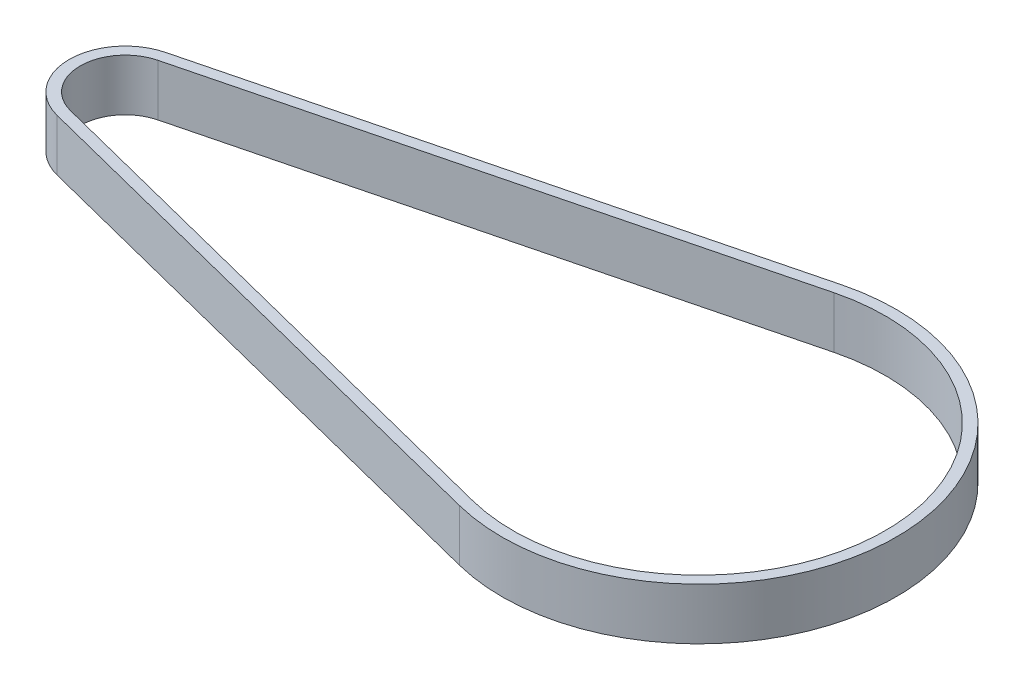
ISO-10303-21;
HEADER;
FILE_DESCRIPTION(('STEP AP214'),'2;1');
FILE_NAME('part.step','',(''),(''),'','','');
FILE_SCHEMA(('AUTOMOTIVE_DESIGN { 1 0 10303 214 1 1 1 1 }'));
ENDSEC;
DATA;
#1=APPLICATION_CONTEXT('core data for automotive mechanical design processes');
#2=APPLICATION_PROTOCOL_DEFINITION('international standard','automotive_design',2000,#1);
#3=PRODUCT_CONTEXT('',#1,'mechanical');
#4=PRODUCT('Part','Part','',(#3));
#5=PRODUCT_RELATED_PRODUCT_CATEGORY('part','',(#4));
#6=PRODUCT_DEFINITION_FORMATION('','',#4);
#7=PRODUCT_DEFINITION_CONTEXT('part definition',#1,'design');
#8=PRODUCT_DEFINITION('design','',#6,#7);
#9=PRODUCT_DEFINITION_SHAPE('','',#8);
#10=(LENGTH_UNIT() NAMED_UNIT(*) SI_UNIT(.MILLI.,.METRE.));
#11=(NAMED_UNIT(*) PLANE_ANGLE_UNIT() SI_UNIT($,.RADIAN.));
#12=(NAMED_UNIT(*) SI_UNIT($,.STERADIAN.) SOLID_ANGLE_UNIT());
#13=UNCERTAINTY_MEASURE_WITH_UNIT(LENGTH_MEASURE(1.E-05),#10,'distance_accuracy_value','');
#14=(GEOMETRIC_REPRESENTATION_CONTEXT(3) GLOBAL_UNCERTAINTY_ASSIGNED_CONTEXT((#13)) GLOBAL_UNIT_ASSIGNED_CONTEXT((#10,
#11,#12)) REPRESENTATION_CONTEXT('',''));
#15=CARTESIAN_POINT('',(0.,0.,0.));
#16=DIRECTION('',(0.,0.,1.));
#17=DIRECTION('',(1.,0.,0.));
#18=AXIS2_PLACEMENT_3D('',#15,#16,#17);
#19=CARTESIAN_POINT('',(0.,7.,0.));
#20=DIRECTION('',(0.,1.,0.));
#21=DIRECTION('',(0.,0.,1.));
#22=AXIS2_PLACEMENT_3D('',#19,#20,#21);
#23=PLANE('',#22);
#24=CARTESIAN_POINT('',(0.,7.,0.));
#25=DIRECTION('',(0.,1.,0.));
#26=DIRECTION('',(0.,0.,1.));
#27=AXIS2_PLACEMENT_3D('',#24,#25,#26);
#28=CIRCLE('',#27,7.6);
#29=CARTESIAN_POINT('',(-1.86821106821106,7.,-7.36680306541539));
#30=VERTEX_POINT('',#29);
#31=CARTESIAN_POINT('',(-1.86821106821107,7.,7.36680306541539));
#32=VERTEX_POINT('',#31);
#33=EDGE_CURVE('E134',#30,#32,#28,.T.);
#34=ORIENTED_EDGE('',*,*,#33,.T.);
#35=DIRECTION('',(0.969316192817815,0.,0.245817245817246));
#36=VECTOR('',#35,1.);
#37=CARTESIAN_POINT('',(-1.86821106821107,7.,7.36680306541539));
#38=LINE('',#37,#36);
#39=CARTESIAN_POINT('',(71.1366795366795,7.,25.8807423482356));
#40=VERTEX_POINT('',#39);
#41=EDGE_CURVE('E137',#32,#40,#38,.T.);
#42=ORIENTED_EDGE('',*,*,#41,.T.);
#43=CARTESIAN_POINT('',(77.7,7.,0.));
#44=DIRECTION('',(0.,1.,0.));
#45=DIRECTION('',(0.,0.,1.));
#46=AXIS2_PLACEMENT_3D('',#43,#44,#45);
#47=CIRCLE('',#46,26.7);
#48=CARTESIAN_POINT('',(71.1366795366796,7.,-25.8807423482356));
#49=VERTEX_POINT('',#48);
#50=EDGE_CURVE('E140',#40,#49,#47,.T.);
#51=ORIENTED_EDGE('',*,*,#50,.T.);
#52=DIRECTION('',(-0.969316192817815,0.,0.245817245817245));
#53=VECTOR('',#52,1.);
#54=CARTESIAN_POINT('',(-1.86821106821106,7.,-7.36680306541539));
#55=LINE('',#54,#53);
#56=EDGE_CURVE('E142',#49,#30,#55,.T.);
#57=ORIENTED_EDGE('',*,*,#56,.T.);
#58=EDGE_LOOP('',(#34,#42,#51,#57));
#59=FACE_BOUND('',#58,.T.);
#60=DIRECTION('',(0.969316192817815,0.,0.245817245817245));
#61=VECTOR('',#60,1.);
#62=CARTESIAN_POINT('',(-1.4994851994852,7.,5.91282877618867));
#63=LINE('',#62,#61);
#64=CARTESIAN_POINT('',(-1.4994851994852,7.,5.91282877618867));
#65=VERTEX_POINT('',#64);
#66=CARTESIAN_POINT('',(71.5054054054054,7.,24.4267680590089));
#67=VERTEX_POINT('',#66);
#68=EDGE_CURVE('E106',#65,#67,#63,.T.);
#69=ORIENTED_EDGE('',*,*,#68,.F.);
#70=CARTESIAN_POINT('',(0.,7.,0.));
#71=DIRECTION('',(0.,1.,0.));
#72=DIRECTION('',(0.,0.,1.));
#73=AXIS2_PLACEMENT_3D('',#70,#71,#72);
#74=CIRCLE('',#73,6.09999999999999);
#75=CARTESIAN_POINT('',(-1.4994851994852,7.,-5.91282877618867));
#76=VERTEX_POINT('',#75);
#77=EDGE_CURVE('E98',#76,#65,#74,.T.);
#78=ORIENTED_EDGE('',*,*,#77,.F.);
#79=DIRECTION('',(-0.969316192817815,0.,0.245817245817245));
#80=VECTOR('',#79,1.);
#81=CARTESIAN_POINT('',(-1.4994851994852,7.,-5.91282877618867));
#82=LINE('',#81,#80);
#83=CARTESIAN_POINT('',(71.5054054054054,7.,-24.4267680590089));
#84=VERTEX_POINT('',#83);
#85=EDGE_CURVE('E120',#84,#76,#82,.T.);
#86=ORIENTED_EDGE('',*,*,#85,.F.);
#87=CARTESIAN_POINT('',(77.7,7.,0.));
#88=DIRECTION('',(0.,1.,0.));
#89=DIRECTION('',(0.,0.,1.));
#90=AXIS2_PLACEMENT_3D('',#87,#88,#89);
#91=CIRCLE('',#90,25.2);
#92=EDGE_CURVE('E118',#67,#84,#91,.T.);
#93=ORIENTED_EDGE('',*,*,#92,.F.);
#94=EDGE_LOOP('',(#69,#78,#86,#93));
#95=FACE_BOUND('',#94,.T.);
#96=ADVANCED_FACE('F33',(#59,#95),#23,.T.);
#97=CARTESIAN_POINT('',(0.,0.,0.));
#98=DIRECTION('',(0.,1.,0.));
#99=DIRECTION('',(0.,0.,1.));
#100=AXIS2_PLACEMENT_3D('',#97,#98,#99);
#101=PLANE('',#100);
#102=CARTESIAN_POINT('',(0.,0.,0.));
#103=DIRECTION('',(0.,1.,0.));
#104=DIRECTION('',(0.,0.,1.));
#105=AXIS2_PLACEMENT_3D('',#102,#103,#104);
#106=CIRCLE('',#105,7.6);
#107=CARTESIAN_POINT('',(-1.86821106821106,0.,-7.36680306541539));
#108=VERTEX_POINT('',#107);
#109=CARTESIAN_POINT('',(-1.86821106821107,0.,7.36680306541539));
#110=VERTEX_POINT('',#109);
#111=EDGE_CURVE('E114',#108,#110,#106,.T.);
#112=ORIENTED_EDGE('',*,*,#111,.F.);
#113=DIRECTION('',(-0.969316192817815,0.,0.245817245817245));
#114=VECTOR('',#113,1.);
#115=CARTESIAN_POINT('',(-1.86821106821106,0.,-7.36680306541539));
#116=LINE('',#115,#114);
#117=CARTESIAN_POINT('',(71.1366795366796,0.,-25.8807423482356));
#118=VERTEX_POINT('',#117);
#119=EDGE_CURVE('E138',#118,#108,#116,.T.);
#120=ORIENTED_EDGE('',*,*,#119,.F.);
#121=CARTESIAN_POINT('',(77.7,0.,0.));
#122=DIRECTION('',(0.,1.,0.));
#123=DIRECTION('',(0.,0.,1.));
#124=AXIS2_PLACEMENT_3D('',#121,#122,#123);
#125=CIRCLE('',#124,26.7);
#126=CARTESIAN_POINT('',(71.1366795366795,0.,25.8807423482356));
#127=VERTEX_POINT('',#126);
#128=EDGE_CURVE('E149',#127,#118,#125,.T.);
#129=ORIENTED_EDGE('',*,*,#128,.F.);
#130=DIRECTION('',(0.969316192817815,0.,0.245817245817246));
#131=VECTOR('',#130,1.);
#132=CARTESIAN_POINT('',(-1.86821106821107,0.,7.36680306541539));
#133=LINE('',#132,#131);
#134=EDGE_CURVE('E147',#110,#127,#133,.T.);
#135=ORIENTED_EDGE('',*,*,#134,.F.);
#136=EDGE_LOOP('',(#112,#120,#129,#135));
#137=FACE_BOUND('',#136,.T.);
#138=CARTESIAN_POINT('',(0.,0.,0.));
#139=DIRECTION('',(0.,1.,0.));
#140=DIRECTION('',(0.,0.,1.));
#141=AXIS2_PLACEMENT_3D('',#138,#139,#140);
#142=CIRCLE('',#141,6.09999999999999);
#143=CARTESIAN_POINT('',(-1.4994851994852,0.,-5.91282877618867));
#144=VERTEX_POINT('',#143);
#145=CARTESIAN_POINT('',(-1.4994851994852,0.,5.91282877618867));
#146=VERTEX_POINT('',#145);
#147=EDGE_CURVE('E56',#144,#146,#142,.T.);
#148=ORIENTED_EDGE('',*,*,#147,.T.);
#149=DIRECTION('',(0.969316192817815,0.,0.245817245817245));
#150=VECTOR('',#149,1.);
#151=CARTESIAN_POINT('',(-1.4994851994852,0.,5.91282877618867));
#152=LINE('',#151,#150);
#153=CARTESIAN_POINT('',(71.5054054054054,0.,24.4267680590089));
#154=VERTEX_POINT('',#153);
#155=EDGE_CURVE('E113',#146,#154,#152,.T.);
#156=ORIENTED_EDGE('',*,*,#155,.T.);
#157=CARTESIAN_POINT('',(77.7,0.,0.));
#158=DIRECTION('',(0.,1.,0.));
#159=DIRECTION('',(0.,0.,1.));
#160=AXIS2_PLACEMENT_3D('',#157,#158,#159);
#161=CIRCLE('',#160,25.2);
#162=CARTESIAN_POINT('',(71.5054054054054,0.,-24.4267680590089));
#163=VERTEX_POINT('',#162);
#164=EDGE_CURVE('E126',#154,#163,#161,.T.);
#165=ORIENTED_EDGE('',*,*,#164,.T.);
#166=DIRECTION('',(-0.969316192817815,0.,0.245817245817245));
#167=VECTOR('',#166,1.);
#168=CARTESIAN_POINT('',(-1.4994851994852,0.,-5.91282877618867));
#169=LINE('',#168,#167);
#170=EDGE_CURVE('E107',#163,#144,#169,.T.);
#171=ORIENTED_EDGE('',*,*,#170,.T.);
#172=EDGE_LOOP('',(#148,#156,#165,#171));
#173=FACE_BOUND('',#172,.T.);
#174=ADVANCED_FACE('F167',(#137,#173),#101,.F.);
#175=CARTESIAN_POINT('',(0.,7.,0.));
#176=DIRECTION('',(0.,-1.,0.));
#177=DIRECTION('',(0.,0.,-1.));
#178=AXIS2_PLACEMENT_3D('',#175,#176,#177);
#179=CYLINDRICAL_SURFACE('',#178,7.6);
#180=ORIENTED_EDGE('',*,*,#111,.T.);
#181=DIRECTION('',(0.,-1.,0.));
#182=VECTOR('',#181,1.);
#183=CARTESIAN_POINT('',(-1.86821106821107,7.,7.36680306541539));
#184=LINE('',#183,#182);
#185=EDGE_CURVE('E11',#32,#110,#184,.T.);
#186=ORIENTED_EDGE('',*,*,#185,.F.);
#187=ORIENTED_EDGE('',*,*,#33,.F.);
#188=DIRECTION('',(0.,-1.,0.));
#189=VECTOR('',#188,1.);
#190=CARTESIAN_POINT('',(-1.86821106821106,7.,-7.36680306541539));
#191=LINE('',#190,#189);
#192=EDGE_CURVE('E144',#30,#108,#191,.T.);
#193=ORIENTED_EDGE('',*,*,#192,.T.);
#194=EDGE_LOOP('',(#180,#186,#187,#193));
#195=FACE_BOUND('',#194,.T.);
#196=ADVANCED_FACE('F35',(#195),#179,.T.);
#197=CARTESIAN_POINT('',(-1.86821106821107,7.,7.36680306541539));
#198=DIRECTION('',(0.245817245817246,0.,-0.969316192817815));
#199=DIRECTION('',(-0.969316192817815,0.,-0.245817245817246));
#200=AXIS2_PLACEMENT_3D('',#197,#198,#199);
#201=PLANE('',#200);
#202=ORIENTED_EDGE('',*,*,#134,.T.);
#203=DIRECTION('',(0.,-1.,0.));
#204=VECTOR('',#203,1.);
#205=CARTESIAN_POINT('',(71.1366795366795,7.,25.8807423482356));
#206=LINE('',#205,#204);
#207=EDGE_CURVE('E41',#40,#127,#206,.T.);
#208=ORIENTED_EDGE('',*,*,#207,.F.);
#209=ORIENTED_EDGE('',*,*,#41,.F.);
#210=ORIENTED_EDGE('',*,*,#185,.T.);
#211=EDGE_LOOP('',(#202,#208,#209,#210));
#212=FACE_BOUND('',#211,.T.);
#213=ADVANCED_FACE('F177',(#212),#201,.F.);
#214=CARTESIAN_POINT('',(77.7,7.,0.));
#215=DIRECTION('',(0.,-1.,0.));
#216=DIRECTION('',(0.,0.,-1.));
#217=AXIS2_PLACEMENT_3D('',#214,#215,#216);
#218=CYLINDRICAL_SURFACE('',#217,26.7);
#219=ORIENTED_EDGE('',*,*,#128,.T.);
#220=DIRECTION('',(0.,-1.,0.));
#221=VECTOR('',#220,1.);
#222=CARTESIAN_POINT('',(71.1366795366796,7.,-25.8807423482356));
#223=LINE('',#222,#221);
#224=EDGE_CURVE('E154',#49,#118,#223,.T.);
#225=ORIENTED_EDGE('',*,*,#224,.F.);
#226=ORIENTED_EDGE('',*,*,#50,.F.);
#227=ORIENTED_EDGE('',*,*,#207,.T.);
#228=EDGE_LOOP('',(#219,#225,#226,#227));
#229=FACE_BOUND('',#228,.T.);
#230=ADVANCED_FACE('F161',(#229),#218,.T.);
#231=CARTESIAN_POINT('',(-1.86821106821106,7.,-7.36680306541539));
#232=DIRECTION('',(0.245817245817245,0.,0.969316192817815));
#233=DIRECTION('',(0.969316192817815,0.,-0.245817245817245));
#234=AXIS2_PLACEMENT_3D('',#231,#232,#233);
#235=PLANE('',#234);
#236=ORIENTED_EDGE('',*,*,#119,.T.);
#237=ORIENTED_EDGE('',*,*,#192,.F.);
#238=ORIENTED_EDGE('',*,*,#56,.F.);
#239=ORIENTED_EDGE('',*,*,#224,.T.);
#240=EDGE_LOOP('',(#236,#237,#238,#239));
#241=FACE_BOUND('',#240,.T.);
#242=ADVANCED_FACE('F171',(#241),#235,.F.);
#243=CARTESIAN_POINT('',(0.,7.,0.));
#244=DIRECTION('',(0.,-1.,0.));
#245=DIRECTION('',(0.,0.,-1.));
#246=AXIS2_PLACEMENT_3D('',#243,#244,#245);
#247=CYLINDRICAL_SURFACE('',#246,6.09999999999999);
#248=ORIENTED_EDGE('',*,*,#147,.F.);
#249=DIRECTION('',(0.,-1.,0.));
#250=VECTOR('',#249,1.);
#251=CARTESIAN_POINT('',(-1.4994851994852,7.,-5.91282877618867));
#252=LINE('',#251,#250);
#253=EDGE_CURVE('E102',#76,#144,#252,.T.);
#254=ORIENTED_EDGE('',*,*,#253,.F.);
#255=ORIENTED_EDGE('',*,*,#77,.T.);
#256=DIRECTION('',(0.,-1.,0.));
#257=VECTOR('',#256,1.);
#258=CARTESIAN_POINT('',(-1.4994851994852,7.,5.91282877618867));
#259=LINE('',#258,#257);
#260=EDGE_CURVE('E101',#65,#146,#259,.T.);
#261=ORIENTED_EDGE('',*,*,#260,.T.);
#262=EDGE_LOOP('',(#248,#254,#255,#261));
#263=FACE_BOUND('',#262,.T.);
#264=ADVANCED_FACE('F100',(#263),#247,.F.);
#265=CARTESIAN_POINT('',(-1.4994851994852,7.,5.91282877618867));
#266=DIRECTION('',(0.245817245817245,0.,-0.969316192817815));
#267=DIRECTION('',(-0.969316192817815,0.,-0.245817245817245));
#268=AXIS2_PLACEMENT_3D('',#265,#266,#267);
#269=PLANE('',#268);
#270=ORIENTED_EDGE('',*,*,#155,.F.);
#271=ORIENTED_EDGE('',*,*,#260,.F.);
#272=ORIENTED_EDGE('',*,*,#68,.T.);
#273=DIRECTION('',(0.,-1.,0.));
#274=VECTOR('',#273,1.);
#275=CARTESIAN_POINT('',(71.5054054054054,7.,24.4267680590089));
#276=LINE('',#275,#274);
#277=EDGE_CURVE('E115',#67,#154,#276,.T.);
#278=ORIENTED_EDGE('',*,*,#277,.T.);
#279=EDGE_LOOP('',(#270,#271,#272,#278));
#280=FACE_BOUND('',#279,.T.);
#281=ADVANCED_FACE('F110',(#280),#269,.T.);
#282=CARTESIAN_POINT('',(77.7,7.,0.));
#283=DIRECTION('',(0.,-1.,0.));
#284=DIRECTION('',(0.,0.,-1.));
#285=AXIS2_PLACEMENT_3D('',#282,#283,#284);
#286=CYLINDRICAL_SURFACE('',#285,25.2);
#287=ORIENTED_EDGE('',*,*,#164,.F.);
#288=ORIENTED_EDGE('',*,*,#277,.F.);
#289=ORIENTED_EDGE('',*,*,#92,.T.);
#290=DIRECTION('',(0.,-1.,0.));
#291=VECTOR('',#290,1.);
#292=CARTESIAN_POINT('',(71.5054054054054,7.,-24.4267680590089));
#293=LINE('',#292,#291);
#294=EDGE_CURVE('E48',#84,#163,#293,.T.);
#295=ORIENTED_EDGE('',*,*,#294,.T.);
#296=EDGE_LOOP('',(#287,#288,#289,#295));
#297=FACE_BOUND('',#296,.T.);
#298=ADVANCED_FACE('F200',(#297),#286,.F.);
#299=CARTESIAN_POINT('',(-1.4994851994852,7.,-5.91282877618867));
#300=DIRECTION('',(0.245817245817245,0.,0.969316192817815));
#301=DIRECTION('',(0.969316192817815,0.,-0.245817245817245));
#302=AXIS2_PLACEMENT_3D('',#299,#300,#301);
#303=PLANE('',#302);
#304=ORIENTED_EDGE('',*,*,#170,.F.);
#305=ORIENTED_EDGE('',*,*,#294,.F.);
#306=ORIENTED_EDGE('',*,*,#85,.T.);
#307=ORIENTED_EDGE('',*,*,#253,.T.);
#308=EDGE_LOOP('',(#304,#305,#306,#307));
#309=FACE_BOUND('',#308,.T.);
#310=ADVANCED_FACE('F204',(#309),#303,.T.);
#311=CLOSED_SHELL('',(#96,#174,#196,#213,#230,#242,#264,#281,#298,#310));
#312=MANIFOLD_SOLID_BREP('B2',#311);
#313=ADVANCED_BREP_SHAPE_REPRESENTATION('',(#18,#312),#14);
#314=SHAPE_DEFINITION_REPRESENTATION(#9,#313);
ENDSEC;
END-ISO-10303-21;
